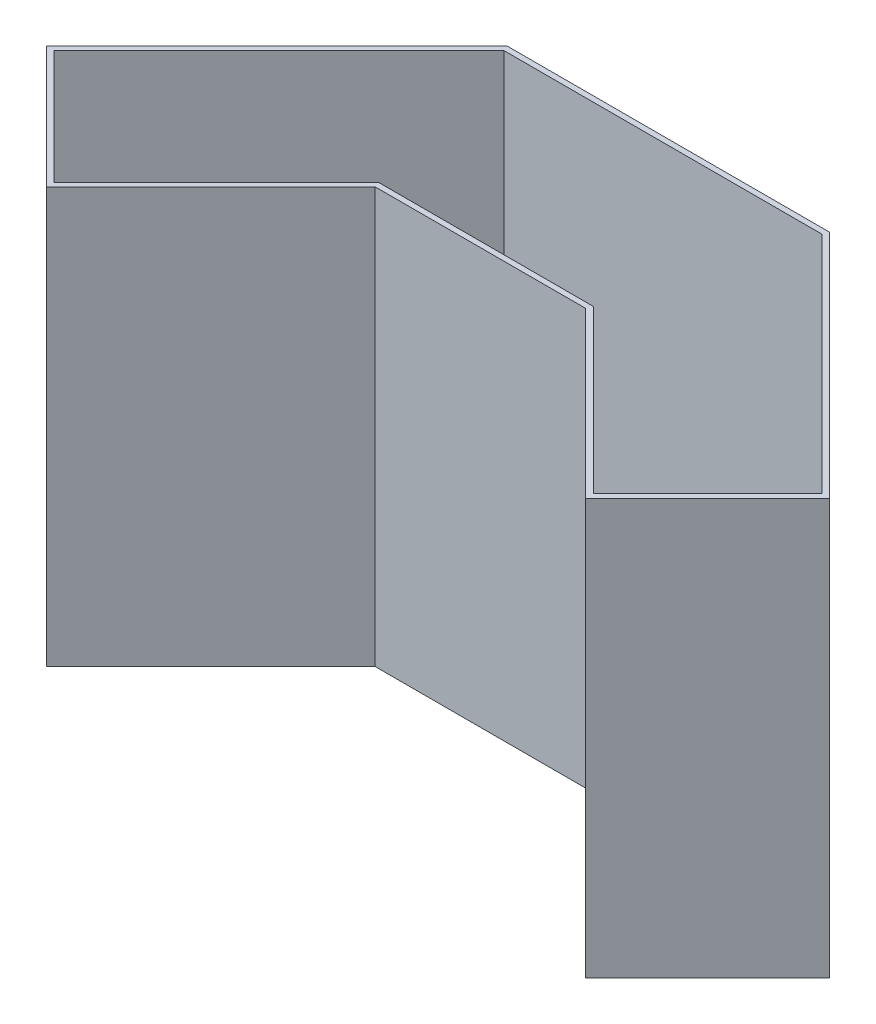
ISO-10303-21;
HEADER;
FILE_DESCRIPTION(('STEP AP214'),'2;1');
FILE_NAME('part.step','',(''),(''),'','','');
FILE_SCHEMA(('AUTOMOTIVE_DESIGN { 1 0 10303 214 1 1 1 1 }'));
ENDSEC;
DATA;
#1=APPLICATION_CONTEXT('core data for automotive mechanical design processes');
#2=APPLICATION_PROTOCOL_DEFINITION('international standard','automotive_design',2000,#1);
#3=PRODUCT_CONTEXT('',#1,'mechanical');
#4=PRODUCT('Part','Part','',(#3));
#5=PRODUCT_RELATED_PRODUCT_CATEGORY('part','',(#4));
#6=PRODUCT_DEFINITION_FORMATION('','',#4);
#7=PRODUCT_DEFINITION_CONTEXT('part definition',#1,'design');
#8=PRODUCT_DEFINITION('design','',#6,#7);
#9=PRODUCT_DEFINITION_SHAPE('','',#8);
#10=(LENGTH_UNIT() NAMED_UNIT(*) SI_UNIT(.MILLI.,.METRE.));
#11=(NAMED_UNIT(*) PLANE_ANGLE_UNIT() SI_UNIT($,.RADIAN.));
#12=(NAMED_UNIT(*) SI_UNIT($,.STERADIAN.) SOLID_ANGLE_UNIT());
#13=UNCERTAINTY_MEASURE_WITH_UNIT(LENGTH_MEASURE(1.E-05),#10,'distance_accuracy_value','');
#14=(GEOMETRIC_REPRESENTATION_CONTEXT(3) GLOBAL_UNCERTAINTY_ASSIGNED_CONTEXT((#13)) GLOBAL_UNIT_ASSIGNED_CONTEXT((#10,
#11,#12)) REPRESENTATION_CONTEXT('',''));
#15=CARTESIAN_POINT('',(0.,0.,0.));
#16=DIRECTION('',(0.,0.,1.));
#17=DIRECTION('',(1.,0.,0.));
#18=AXIS2_PLACEMENT_3D('',#15,#16,#17);
#19=CARTESIAN_POINT('',(0.,150.,0.));
#20=DIRECTION('',(0.,1.,0.));
#21=DIRECTION('',(0.,0.,1.));
#22=AXIS2_PLACEMENT_3D('',#19,#20,#21);
#23=PLANE('',#22);
#24=DIRECTION('',(-0.707106781186546,0.,0.707106781186549));
#25=VECTOR('',#24,1.);
#26=CARTESIAN_POINT('',(-58.2309419795097,150.,-2.));
#27=LINE('',#26,#25);
#28=CARTESIAN_POINT('',(-58.2309419795097,150.,-2.));
#29=VERTEX_POINT('',#28);
#30=CARTESIAN_POINT('',(-141.410357001439,150.,81.1794150219298));
#31=VERTEX_POINT('',#30);
#32=EDGE_CURVE('E218',#29,#31,#27,.T.);
#33=ORIENTED_EDGE('',*,*,#32,.T.);
#34=DIRECTION('',(0.707106781186549,0.,0.707106781186546));
#35=VECTOR('',#34,1.);
#36=CARTESIAN_POINT('',(-141.410357001439,150.,81.1794150219298));
#37=LINE('',#36,#35);
#38=CARTESIAN_POINT('',(-97.3702602736448,150.,125.219511749724));
#39=VERTEX_POINT('',#38);
#40=EDGE_CURVE('E225',#31,#39,#37,.T.);
#41=ORIENTED_EDGE('',*,*,#40,.T.);
#42=DIRECTION('',(0.707106781186546,0.,-0.707106781186549));
#43=VECTOR('',#42,1.);
#44=CARTESIAN_POINT('',(-38.0056469493385,150.,65.8548984254173));
#45=LINE('',#44,#43);
#46=CARTESIAN_POINT('',(-38.0056469493385,150.,65.8548984254173));
#47=VERTEX_POINT('',#46);
#48=EDGE_CURVE('E223',#39,#47,#45,.T.);
#49=ORIENTED_EDGE('',*,*,#48,.T.);
#50=DIRECTION('',(1.,0.,0.));
#51=VECTOR('',#50,1.);
#52=CARTESIAN_POINT('',(-38.0056469493385,150.,65.8548984254173));
#53=LINE('',#52,#51);
#54=CARTESIAN_POINT('',(38.0056469493385,150.,65.8548984254173));
#55=VERTEX_POINT('',#54);
#56=EDGE_CURVE('E227',#47,#55,#53,.T.);
#57=ORIENTED_EDGE('',*,*,#56,.T.);
#58=DIRECTION('',(0.707106781186546,0.,0.707106781186549));
#59=VECTOR('',#58,1.);
#60=CARTESIAN_POINT('',(38.0056469493385,150.,65.8548984254173));
#61=LINE('',#60,#59);
#62=CARTESIAN_POINT('',(97.3702602736448,150.,125.219511749724));
#63=VERTEX_POINT('',#62);
#64=EDGE_CURVE('E228',#55,#63,#61,.T.);
#65=ORIENTED_EDGE('',*,*,#64,.T.);
#66=DIRECTION('',(0.707106781186549,0.,-0.707106781186546));
#67=VECTOR('',#66,1.);
#68=CARTESIAN_POINT('',(141.410357001439,150.,81.1794150219297));
#69=LINE('',#68,#67);
#70=CARTESIAN_POINT('',(141.410357001439,150.,81.1794150219297));
#71=VERTEX_POINT('',#70);
#72=EDGE_CURVE('E231',#63,#71,#69,.T.);
#73=ORIENTED_EDGE('',*,*,#72,.T.);
#74=DIRECTION('',(-0.707106781186546,0.,-0.707106781186549));
#75=VECTOR('',#74,1.);
#76=CARTESIAN_POINT('',(58.2309419795097,150.,-2.));
#77=LINE('',#76,#75);
#78=CARTESIAN_POINT('',(58.2309419795097,150.,-2.));
#79=VERTEX_POINT('',#78);
#80=EDGE_CURVE('E233',#71,#79,#77,.T.);
#81=ORIENTED_EDGE('',*,*,#80,.T.);
#82=DIRECTION('',(-1.,0.,0.));
#83=VECTOR('',#82,1.);
#84=CARTESIAN_POINT('',(-58.2309419795097,150.,-2.));
#85=LINE('',#84,#83);
#86=EDGE_CURVE('E234',#79,#29,#85,.T.);
#87=ORIENTED_EDGE('',*,*,#86,.T.);
#88=EDGE_LOOP('',(#33,#41,#49,#57,#65,#73,#81,#87));
#89=FACE_BOUND('',#88,.T.);
#90=DIRECTION('',(0.707106781186549,0.,0.707106781186546));
#91=VECTOR('',#90,1.);
#92=CARTESIAN_POINT('',(-138.581929876693,150.,81.1794150219298));
#93=LINE('',#92,#91);
#94=CARTESIAN_POINT('',(-138.581929876693,150.,81.1794150219298));
#95=VERTEX_POINT('',#94);
#96=CARTESIAN_POINT('',(-97.3702602736448,150.,122.391084624978));
#97=VERTEX_POINT('',#96);
#98=EDGE_CURVE('E165',#95,#97,#93,.T.);
#99=ORIENTED_EDGE('',*,*,#98,.F.);
#100=DIRECTION('',(-0.707106781186546,0.,0.707106781186549));
#101=VECTOR('',#100,1.);
#102=CARTESIAN_POINT('',(-57.4025148547635,150.,0.));
#103=LINE('',#102,#101);
#104=CARTESIAN_POINT('',(-57.4025148547635,150.,0.));
#105=VERTEX_POINT('',#104);
#106=EDGE_CURVE('E152',#105,#95,#103,.T.);
#107=ORIENTED_EDGE('',*,*,#106,.F.);
#108=DIRECTION('',(-1.,0.,0.));
#109=VECTOR('',#108,1.);
#110=CARTESIAN_POINT('',(-57.4025148547635,150.,0.));
#111=LINE('',#110,#109);
#112=CARTESIAN_POINT('',(57.4025148547635,150.,0.));
#113=VERTEX_POINT('',#112);
#114=EDGE_CURVE('E187',#113,#105,#111,.T.);
#115=ORIENTED_EDGE('',*,*,#114,.F.);
#116=DIRECTION('',(-0.707106781186546,0.,-0.707106781186549));
#117=VECTOR('',#116,1.);
#118=CARTESIAN_POINT('',(57.4025148547635,150.,0.));
#119=LINE('',#118,#117);
#120=CARTESIAN_POINT('',(138.581929876693,150.,81.1794150219297));
#121=VERTEX_POINT('',#120);
#122=EDGE_CURVE('E183',#121,#113,#119,.T.);
#123=ORIENTED_EDGE('',*,*,#122,.F.);
#124=DIRECTION('',(0.707106781186549,0.,-0.707106781186546));
#125=VECTOR('',#124,1.);
#126=CARTESIAN_POINT('',(138.581929876693,150.,81.1794150219297));
#127=LINE('',#126,#125);
#128=CARTESIAN_POINT('',(97.3702602736448,150.,122.391084624978));
#129=VERTEX_POINT('',#128);
#130=EDGE_CURVE('E181',#129,#121,#127,.T.);
#131=ORIENTED_EDGE('',*,*,#130,.F.);
#132=DIRECTION('',(0.707106781186546,0.,0.707106781186549));
#133=VECTOR('',#132,1.);
#134=CARTESIAN_POINT('',(38.8340740740847,150.,63.8548984254173));
#135=LINE('',#134,#133);
#136=CARTESIAN_POINT('',(38.8340740740847,150.,63.8548984254173));
#137=VERTEX_POINT('',#136);
#138=EDGE_CURVE('E182',#137,#129,#135,.T.);
#139=ORIENTED_EDGE('',*,*,#138,.F.);
#140=DIRECTION('',(1.,0.,0.));
#141=VECTOR('',#140,1.);
#142=CARTESIAN_POINT('',(-38.8340740740847,150.,63.8548984254173));
#143=LINE('',#142,#141);
#144=CARTESIAN_POINT('',(-38.8340740740847,150.,63.8548984254173));
#145=VERTEX_POINT('',#144);
#146=EDGE_CURVE('E180',#145,#137,#143,.T.);
#147=ORIENTED_EDGE('',*,*,#146,.F.);
#148=DIRECTION('',(0.707106781186546,0.,-0.707106781186549));
#149=VECTOR('',#148,1.);
#150=CARTESIAN_POINT('',(-38.8340740740847,150.,63.8548984254173));
#151=LINE('',#150,#149);
#152=EDGE_CURVE('E175',#97,#145,#151,.T.);
#153=ORIENTED_EDGE('',*,*,#152,.F.);
#154=EDGE_LOOP('',(#99,#107,#115,#123,#131,#139,#147,#153));
#155=FACE_BOUND('',#154,.T.);
#156=ADVANCED_FACE('F41',(#89,#155),#23,.T.);
#157=CARTESIAN_POINT('',(0.,0.,0.));
#158=DIRECTION('',(0.,1.,0.));
#159=DIRECTION('',(0.,0.,1.));
#160=AXIS2_PLACEMENT_3D('',#157,#158,#159);
#161=PLANE('',#160);
#162=DIRECTION('',(-0.707106781186546,0.,0.707106781186549));
#163=VECTOR('',#162,1.);
#164=CARTESIAN_POINT('',(-58.2309419795097,0.,-2.));
#165=LINE('',#164,#163);
#166=CARTESIAN_POINT('',(-58.2309419795097,0.,-2.));
#167=VERTEX_POINT('',#166);
#168=CARTESIAN_POINT('',(-141.410357001439,0.,81.1794150219298));
#169=VERTEX_POINT('',#168);
#170=EDGE_CURVE('E168',#167,#169,#165,.T.);
#171=ORIENTED_EDGE('',*,*,#170,.F.);
#172=DIRECTION('',(-1.,0.,0.));
#173=VECTOR('',#172,1.);
#174=CARTESIAN_POINT('',(-58.2309419795097,0.,-2.));
#175=LINE('',#174,#173);
#176=CARTESIAN_POINT('',(58.2309419795097,0.,-2.));
#177=VERTEX_POINT('',#176);
#178=EDGE_CURVE('E224',#177,#167,#175,.T.);
#179=ORIENTED_EDGE('',*,*,#178,.F.);
#180=DIRECTION('',(-0.707106781186546,0.,-0.707106781186549));
#181=VECTOR('',#180,1.);
#182=CARTESIAN_POINT('',(58.2309419795097,0.,-2.));
#183=LINE('',#182,#181);
#184=CARTESIAN_POINT('',(141.410357001439,0.,81.1794150219297));
#185=VERTEX_POINT('',#184);
#186=EDGE_CURVE('E249',#185,#177,#183,.T.);
#187=ORIENTED_EDGE('',*,*,#186,.F.);
#188=DIRECTION('',(0.707106781186549,0.,-0.707106781186546));
#189=VECTOR('',#188,1.);
#190=CARTESIAN_POINT('',(141.410357001439,0.,81.1794150219297));
#191=LINE('',#190,#189);
#192=CARTESIAN_POINT('',(97.3702602736448,0.,125.219511749724));
#193=VERTEX_POINT('',#192);
#194=EDGE_CURVE('E248',#193,#185,#191,.T.);
#195=ORIENTED_EDGE('',*,*,#194,.F.);
#196=DIRECTION('',(0.707106781186546,0.,0.707106781186549));
#197=VECTOR('',#196,1.);
#198=CARTESIAN_POINT('',(38.0056469493385,0.,65.8548984254173));
#199=LINE('',#198,#197);
#200=CARTESIAN_POINT('',(38.0056469493385,0.,65.8548984254173));
#201=VERTEX_POINT('',#200);
#202=EDGE_CURVE('E246',#201,#193,#199,.T.);
#203=ORIENTED_EDGE('',*,*,#202,.F.);
#204=DIRECTION('',(1.,0.,0.));
#205=VECTOR('',#204,1.);
#206=CARTESIAN_POINT('',(-38.0056469493385,0.,65.8548984254173));
#207=LINE('',#206,#205);
#208=CARTESIAN_POINT('',(-38.0056469493385,0.,65.8548984254173));
#209=VERTEX_POINT('',#208);
#210=EDGE_CURVE('E243',#209,#201,#207,.T.);
#211=ORIENTED_EDGE('',*,*,#210,.F.);
#212=DIRECTION('',(0.707106781186546,0.,-0.707106781186549));
#213=VECTOR('',#212,1.);
#214=CARTESIAN_POINT('',(-38.0056469493385,0.,65.8548984254173));
#215=LINE('',#214,#213);
#216=CARTESIAN_POINT('',(-97.3702602736448,0.,125.219511749724));
#217=VERTEX_POINT('',#216);
#218=EDGE_CURVE('E242',#217,#209,#215,.T.);
#219=ORIENTED_EDGE('',*,*,#218,.F.);
#220=DIRECTION('',(0.707106781186549,0.,0.707106781186546));
#221=VECTOR('',#220,1.);
#222=CARTESIAN_POINT('',(-141.410357001439,0.,81.1794150219298));
#223=LINE('',#222,#221);
#224=EDGE_CURVE('E238',#169,#217,#223,.T.);
#225=ORIENTED_EDGE('',*,*,#224,.F.);
#226=EDGE_LOOP('',(#171,#179,#187,#195,#203,#211,#219,#225));
#227=FACE_BOUND('',#226,.T.);
#228=DIRECTION('',(-0.707106781186546,0.,0.707106781186549));
#229=VECTOR('',#228,1.);
#230=CARTESIAN_POINT('',(-57.4025148547635,0.,0.));
#231=LINE('',#230,#229);
#232=CARTESIAN_POINT('',(-57.4025148547635,0.,0.));
#233=VERTEX_POINT('',#232);
#234=CARTESIAN_POINT('',(-138.581929876693,0.,81.1794150219298));
#235=VERTEX_POINT('',#234);
#236=EDGE_CURVE('E63',#233,#235,#231,.T.);
#237=ORIENTED_EDGE('',*,*,#236,.T.);
#238=DIRECTION('',(0.707106781186549,0.,0.707106781186546));
#239=VECTOR('',#238,1.);
#240=CARTESIAN_POINT('',(-138.581929876693,0.,81.1794150219298));
#241=LINE('',#240,#239);
#242=CARTESIAN_POINT('',(-97.3702602736448,0.,122.391084624978));
#243=VERTEX_POINT('',#242);
#244=EDGE_CURVE('E166',#235,#243,#241,.T.);
#245=ORIENTED_EDGE('',*,*,#244,.T.);
#246=DIRECTION('',(0.707106781186546,0.,-0.707106781186549));
#247=VECTOR('',#246,1.);
#248=CARTESIAN_POINT('',(-38.8340740740847,0.,63.8548984254173));
#249=LINE('',#248,#247);
#250=CARTESIAN_POINT('',(-38.8340740740847,0.,63.8548984254173));
#251=VERTEX_POINT('',#250);
#252=EDGE_CURVE('E191',#243,#251,#249,.T.);
#253=ORIENTED_EDGE('',*,*,#252,.T.);
#254=DIRECTION('',(1.,0.,0.));
#255=VECTOR('',#254,1.);
#256=CARTESIAN_POINT('',(-38.8340740740847,0.,63.8548984254173));
#257=LINE('',#256,#255);
#258=CARTESIAN_POINT('',(38.8340740740847,0.,63.8548984254173));
#259=VERTEX_POINT('',#258);
#260=EDGE_CURVE('E192',#251,#259,#257,.T.);
#261=ORIENTED_EDGE('',*,*,#260,.T.);
#262=DIRECTION('',(0.707106781186546,0.,0.707106781186549));
#263=VECTOR('',#262,1.);
#264=CARTESIAN_POINT('',(38.8340740740847,0.,63.8548984254173));
#265=LINE('',#264,#263);
#266=CARTESIAN_POINT('',(97.3702602736448,0.,122.391084624978));
#267=VERTEX_POINT('',#266);
#268=EDGE_CURVE('E197',#259,#267,#265,.T.);
#269=ORIENTED_EDGE('',*,*,#268,.T.);
#270=DIRECTION('',(0.707106781186549,0.,-0.707106781186546));
#271=VECTOR('',#270,1.);
#272=CARTESIAN_POINT('',(138.581929876693,0.,81.1794150219297));
#273=LINE('',#272,#271);
#274=CARTESIAN_POINT('',(138.581929876693,0.,81.1794150219297));
#275=VERTEX_POINT('',#274);
#276=EDGE_CURVE('E199',#267,#275,#273,.T.);
#277=ORIENTED_EDGE('',*,*,#276,.T.);
#278=DIRECTION('',(-0.707106781186546,0.,-0.707106781186549));
#279=VECTOR('',#278,1.);
#280=CARTESIAN_POINT('',(57.4025148547635,0.,0.));
#281=LINE('',#280,#279);
#282=CARTESIAN_POINT('',(57.4025148547635,0.,0.));
#283=VERTEX_POINT('',#282);
#284=EDGE_CURVE('E201',#275,#283,#281,.T.);
#285=ORIENTED_EDGE('',*,*,#284,.T.);
#286=DIRECTION('',(-1.,0.,0.));
#287=VECTOR('',#286,1.);
#288=CARTESIAN_POINT('',(-57.4025148547635,0.,0.));
#289=LINE('',#288,#287);
#290=EDGE_CURVE('E162',#283,#233,#289,.T.);
#291=ORIENTED_EDGE('',*,*,#290,.T.);
#292=EDGE_LOOP('',(#237,#245,#253,#261,#269,#277,#285,#291));
#293=FACE_BOUND('',#292,.T.);
#294=ADVANCED_FACE('F278',(#227,#293),#161,.F.);
#295=CARTESIAN_POINT('',(-58.2309419795097,150.,-2.));
#296=DIRECTION('',(0.707106781186549,0.,0.707106781186546));
#297=DIRECTION('',(0.707106781186546,0.,-0.707106781186549));
#298=AXIS2_PLACEMENT_3D('',#295,#296,#297);
#299=PLANE('',#298);
#300=ORIENTED_EDGE('',*,*,#170,.T.);
#301=DIRECTION('',(0.,-1.,0.));
#302=VECTOR('',#301,1.);
#303=CARTESIAN_POINT('',(-141.410357001439,150.,81.1794150219298));
#304=LINE('',#303,#302);
#305=EDGE_CURVE('E11',#31,#169,#304,.T.);
#306=ORIENTED_EDGE('',*,*,#305,.F.);
#307=ORIENTED_EDGE('',*,*,#32,.F.);
#308=DIRECTION('',(0.,-1.,0.));
#309=VECTOR('',#308,1.);
#310=CARTESIAN_POINT('',(-58.2309419795097,150.,-2.));
#311=LINE('',#310,#309);
#312=EDGE_CURVE('E240',#29,#167,#311,.T.);
#313=ORIENTED_EDGE('',*,*,#312,.T.);
#314=EDGE_LOOP('',(#300,#306,#307,#313));
#315=FACE_BOUND('',#314,.T.);
#316=ADVANCED_FACE('F43',(#315),#299,.F.);
#317=CARTESIAN_POINT('',(-141.410357001439,150.,81.1794150219298));
#318=DIRECTION('',(0.707106781186546,0.,-0.707106781186549));
#319=DIRECTION('',(-0.707106781186549,0.,-0.707106781186546));
#320=AXIS2_PLACEMENT_3D('',#317,#318,#319);
#321=PLANE('',#320);
#322=ORIENTED_EDGE('',*,*,#224,.T.);
#323=DIRECTION('',(0.,-1.,0.));
#324=VECTOR('',#323,1.);
#325=CARTESIAN_POINT('',(-97.3702602736448,150.,125.219511749724));
#326=LINE('',#325,#324);
#327=EDGE_CURVE('E47',#39,#217,#326,.T.);
#328=ORIENTED_EDGE('',*,*,#327,.F.);
#329=ORIENTED_EDGE('',*,*,#40,.F.);
#330=ORIENTED_EDGE('',*,*,#305,.T.);
#331=EDGE_LOOP('',(#322,#328,#329,#330));
#332=FACE_BOUND('',#331,.T.);
#333=ADVANCED_FACE('F297',(#332),#321,.F.);
#334=CARTESIAN_POINT('',(-38.0056469493385,150.,65.8548984254173));
#335=DIRECTION('',(-0.707106781186549,0.,-0.707106781186546));
#336=DIRECTION('',(-0.707106781186546,0.,0.707106781186549));
#337=AXIS2_PLACEMENT_3D('',#334,#335,#336);
#338=PLANE('',#337);
#339=ORIENTED_EDGE('',*,*,#218,.T.);
#340=DIRECTION('',(0.,-1.,0.));
#341=VECTOR('',#340,1.);
#342=CARTESIAN_POINT('',(-38.0056469493385,150.,65.8548984254173));
#343=LINE('',#342,#341);
#344=EDGE_CURVE('E270',#47,#209,#343,.T.);
#345=ORIENTED_EDGE('',*,*,#344,.F.);
#346=ORIENTED_EDGE('',*,*,#48,.F.);
#347=ORIENTED_EDGE('',*,*,#327,.T.);
#348=EDGE_LOOP('',(#339,#345,#346,#347));
#349=FACE_BOUND('',#348,.T.);
#350=ADVANCED_FACE('F273',(#349),#338,.F.);
#351=CARTESIAN_POINT('',(-38.0056469493385,150.,65.8548984254173));
#352=DIRECTION('',(0.,0.,-1.));
#353=DIRECTION('',(-1.,0.,0.));
#354=AXIS2_PLACEMENT_3D('',#351,#352,#353);
#355=PLANE('',#354);
#356=ORIENTED_EDGE('',*,*,#210,.T.);
#357=DIRECTION('',(0.,-1.,0.));
#358=VECTOR('',#357,1.);
#359=CARTESIAN_POINT('',(38.0056469493385,150.,65.8548984254173));
#360=LINE('',#359,#358);
#361=EDGE_CURVE('E262',#55,#201,#360,.T.);
#362=ORIENTED_EDGE('',*,*,#361,.F.);
#363=ORIENTED_EDGE('',*,*,#56,.F.);
#364=ORIENTED_EDGE('',*,*,#344,.T.);
#365=EDGE_LOOP('',(#356,#362,#363,#364));
#366=FACE_BOUND('',#365,.T.);
#367=ADVANCED_FACE('F286',(#366),#355,.F.);
#368=CARTESIAN_POINT('',(38.0056469493385,150.,65.8548984254173));
#369=DIRECTION('',(0.707106781186549,0.,-0.707106781186546));
#370=DIRECTION('',(-0.707106781186546,0.,-0.707106781186549));
#371=AXIS2_PLACEMENT_3D('',#368,#369,#370);
#372=PLANE('',#371);
#373=ORIENTED_EDGE('',*,*,#202,.T.);
#374=DIRECTION('',(0.,-1.,0.));
#375=VECTOR('',#374,1.);
#376=CARTESIAN_POINT('',(97.3702602736448,150.,125.219511749724));
#377=LINE('',#376,#375);
#378=EDGE_CURVE('E261',#63,#193,#377,.T.);
#379=ORIENTED_EDGE('',*,*,#378,.F.);
#380=ORIENTED_EDGE('',*,*,#64,.F.);
#381=ORIENTED_EDGE('',*,*,#361,.T.);
#382=EDGE_LOOP('',(#373,#379,#380,#381));
#383=FACE_BOUND('',#382,.T.);
#384=ADVANCED_FACE('F289',(#383),#372,.F.);
#385=CARTESIAN_POINT('',(141.410357001439,150.,81.1794150219297));
#386=DIRECTION('',(-0.707106781186546,0.,-0.707106781186549));
#387=DIRECTION('',(-0.707106781186549,0.,0.707106781186546));
#388=AXIS2_PLACEMENT_3D('',#385,#386,#387);
#389=PLANE('',#388);
#390=ORIENTED_EDGE('',*,*,#194,.T.);
#391=DIRECTION('',(0.,-1.,0.));
#392=VECTOR('',#391,1.);
#393=CARTESIAN_POINT('',(141.410357001439,150.,81.1794150219297));
#394=LINE('',#393,#392);
#395=EDGE_CURVE('E256',#71,#185,#394,.T.);
#396=ORIENTED_EDGE('',*,*,#395,.F.);
#397=ORIENTED_EDGE('',*,*,#72,.F.);
#398=ORIENTED_EDGE('',*,*,#378,.T.);
#399=EDGE_LOOP('',(#390,#396,#397,#398));
#400=FACE_BOUND('',#399,.T.);
#401=ADVANCED_FACE('F309',(#400),#389,.F.);
#402=CARTESIAN_POINT('',(58.2309419795097,150.,-2.));
#403=DIRECTION('',(-0.707106781186549,0.,0.707106781186546));
#404=DIRECTION('',(0.707106781186546,0.,0.707106781186549));
#405=AXIS2_PLACEMENT_3D('',#402,#403,#404);
#406=PLANE('',#405);
#407=ORIENTED_EDGE('',*,*,#186,.T.);
#408=DIRECTION('',(0.,-1.,0.));
#409=VECTOR('',#408,1.);
#410=CARTESIAN_POINT('',(58.2309419795097,150.,-2.));
#411=LINE('',#410,#409);
#412=EDGE_CURVE('E254',#79,#177,#411,.T.);
#413=ORIENTED_EDGE('',*,*,#412,.F.);
#414=ORIENTED_EDGE('',*,*,#80,.F.);
#415=ORIENTED_EDGE('',*,*,#395,.T.);
#416=EDGE_LOOP('',(#407,#413,#414,#415));
#417=FACE_BOUND('',#416,.T.);
#418=ADVANCED_FACE('F306',(#417),#406,.F.);
#419=CARTESIAN_POINT('',(-58.2309419795097,150.,-2.));
#420=DIRECTION('',(0.,0.,1.));
#421=DIRECTION('',(1.,0.,0.));
#422=AXIS2_PLACEMENT_3D('',#419,#420,#421);
#423=PLANE('',#422);
#424=ORIENTED_EDGE('',*,*,#178,.T.);
#425=ORIENTED_EDGE('',*,*,#312,.F.);
#426=ORIENTED_EDGE('',*,*,#86,.F.);
#427=ORIENTED_EDGE('',*,*,#412,.T.);
#428=EDGE_LOOP('',(#424,#425,#426,#427));
#429=FACE_BOUND('',#428,.T.);
#430=ADVANCED_FACE('F303',(#429),#423,.F.);
#431=CARTESIAN_POINT('',(-57.4025148547635,150.,0.));
#432=DIRECTION('',(0.707106781186549,0.,0.707106781186546));
#433=DIRECTION('',(0.707106781186546,0.,-0.707106781186549));
#434=AXIS2_PLACEMENT_3D('',#431,#432,#433);
#435=PLANE('',#434);
#436=ORIENTED_EDGE('',*,*,#236,.F.);
#437=DIRECTION('',(0.,-1.,0.));
#438=VECTOR('',#437,1.);
#439=CARTESIAN_POINT('',(-57.4025148547635,150.,0.));
#440=LINE('',#439,#438);
#441=EDGE_CURVE('E158',#105,#233,#440,.T.);
#442=ORIENTED_EDGE('',*,*,#441,.F.);
#443=ORIENTED_EDGE('',*,*,#106,.T.);
#444=DIRECTION('',(0.,-1.,0.));
#445=VECTOR('',#444,1.);
#446=CARTESIAN_POINT('',(-138.581929876693,150.,81.1794150219298));
#447=LINE('',#446,#445);
#448=EDGE_CURVE('E160',#95,#235,#447,.T.);
#449=ORIENTED_EDGE('',*,*,#448,.T.);
#450=EDGE_LOOP('',(#436,#442,#443,#449));
#451=FACE_BOUND('',#450,.T.);
#452=ADVANCED_FACE('F156',(#451),#435,.T.);
#453=CARTESIAN_POINT('',(-138.581929876693,150.,81.1794150219298));
#454=DIRECTION('',(0.707106781186546,0.,-0.707106781186549));
#455=DIRECTION('',(-0.707106781186549,0.,-0.707106781186546));
#456=AXIS2_PLACEMENT_3D('',#453,#454,#455);
#457=PLANE('',#456);
#458=ORIENTED_EDGE('',*,*,#244,.F.);
#459=ORIENTED_EDGE('',*,*,#448,.F.);
#460=ORIENTED_EDGE('',*,*,#98,.T.);
#461=DIRECTION('',(0.,-1.,0.));
#462=VECTOR('',#461,1.);
#463=CARTESIAN_POINT('',(-97.3702602736448,150.,122.391084624978));
#464=LINE('',#463,#462);
#465=EDGE_CURVE('E171',#97,#243,#464,.T.);
#466=ORIENTED_EDGE('',*,*,#465,.T.);
#467=EDGE_LOOP('',(#458,#459,#460,#466));
#468=FACE_BOUND('',#467,.T.);
#469=ADVANCED_FACE('F167',(#468),#457,.T.);
#470=CARTESIAN_POINT('',(-38.8340740740847,150.,63.8548984254173));
#471=DIRECTION('',(-0.707106781186549,0.,-0.707106781186546));
#472=DIRECTION('',(-0.707106781186546,0.,0.707106781186549));
#473=AXIS2_PLACEMENT_3D('',#470,#471,#472);
#474=PLANE('',#473);
#475=ORIENTED_EDGE('',*,*,#252,.F.);
#476=ORIENTED_EDGE('',*,*,#465,.F.);
#477=ORIENTED_EDGE('',*,*,#152,.T.);
#478=DIRECTION('',(0.,-1.,0.));
#479=VECTOR('',#478,1.);
#480=CARTESIAN_POINT('',(-38.8340740740847,150.,63.8548984254173));
#481=LINE('',#480,#479);
#482=EDGE_CURVE('E216',#145,#251,#481,.T.);
#483=ORIENTED_EDGE('',*,*,#482,.T.);
#484=EDGE_LOOP('',(#475,#476,#477,#483));
#485=FACE_BOUND('',#484,.T.);
#486=ADVANCED_FACE('F333',(#485),#474,.T.);
#487=CARTESIAN_POINT('',(-38.8340740740847,150.,63.8548984254173));
#488=DIRECTION('',(0.,0.,-1.));
#489=DIRECTION('',(-1.,0.,0.));
#490=AXIS2_PLACEMENT_3D('',#487,#488,#489);
#491=PLANE('',#490);
#492=ORIENTED_EDGE('',*,*,#260,.F.);
#493=ORIENTED_EDGE('',*,*,#482,.F.);
#494=ORIENTED_EDGE('',*,*,#146,.T.);
#495=DIRECTION('',(0.,-1.,0.));
#496=VECTOR('',#495,1.);
#497=CARTESIAN_POINT('',(38.8340740740847,150.,63.8548984254173));
#498=LINE('',#497,#496);
#499=EDGE_CURVE('E212',#137,#259,#498,.T.);
#500=ORIENTED_EDGE('',*,*,#499,.T.);
#501=EDGE_LOOP('',(#492,#493,#494,#500));
#502=FACE_BOUND('',#501,.T.);
#503=ADVANCED_FACE('F338',(#502),#491,.T.);
#504=CARTESIAN_POINT('',(38.8340740740847,150.,63.8548984254173));
#505=DIRECTION('',(0.707106781186549,0.,-0.707106781186546));
#506=DIRECTION('',(-0.707106781186546,0.,-0.707106781186549));
#507=AXIS2_PLACEMENT_3D('',#504,#505,#506);
#508=PLANE('',#507);
#509=ORIENTED_EDGE('',*,*,#268,.F.);
#510=ORIENTED_EDGE('',*,*,#499,.F.);
#511=ORIENTED_EDGE('',*,*,#138,.T.);
#512=DIRECTION('',(0.,-1.,0.));
#513=VECTOR('',#512,1.);
#514=CARTESIAN_POINT('',(97.3702602736448,150.,122.391084624978));
#515=LINE('',#514,#513);
#516=EDGE_CURVE('E215',#129,#267,#515,.T.);
#517=ORIENTED_EDGE('',*,*,#516,.T.);
#518=EDGE_LOOP('',(#509,#510,#511,#517));
#519=FACE_BOUND('',#518,.T.);
#520=ADVANCED_FACE('F344',(#519),#508,.T.);
#521=CARTESIAN_POINT('',(138.581929876693,150.,81.1794150219297));
#522=DIRECTION('',(-0.707106781186546,0.,-0.707106781186549));
#523=DIRECTION('',(-0.707106781186549,0.,0.707106781186546));
#524=AXIS2_PLACEMENT_3D('',#521,#522,#523);
#525=PLANE('',#524);
#526=ORIENTED_EDGE('',*,*,#276,.F.);
#527=ORIENTED_EDGE('',*,*,#516,.F.);
#528=ORIENTED_EDGE('',*,*,#130,.T.);
#529=DIRECTION('',(0.,-1.,0.));
#530=VECTOR('',#529,1.);
#531=CARTESIAN_POINT('',(138.581929876693,150.,81.1794150219297));
#532=LINE('',#531,#530);
#533=EDGE_CURVE('E209',#121,#275,#532,.T.);
#534=ORIENTED_EDGE('',*,*,#533,.T.);
#535=EDGE_LOOP('',(#526,#527,#528,#534));
#536=FACE_BOUND('',#535,.T.);
#537=ADVANCED_FACE('F349',(#536),#525,.T.);
#538=CARTESIAN_POINT('',(57.4025148547635,150.,0.));
#539=DIRECTION('',(-0.707106781186549,0.,0.707106781186546));
#540=DIRECTION('',(0.707106781186546,0.,0.707106781186549));
#541=AXIS2_PLACEMENT_3D('',#538,#539,#540);
#542=PLANE('',#541);
#543=ORIENTED_EDGE('',*,*,#284,.F.);
#544=ORIENTED_EDGE('',*,*,#533,.F.);
#545=ORIENTED_EDGE('',*,*,#122,.T.);
#546=DIRECTION('',(0.,-1.,0.));
#547=VECTOR('',#546,1.);
#548=CARTESIAN_POINT('',(57.4025148547635,150.,0.));
#549=LINE('',#548,#547);
#550=EDGE_CURVE('E57',#113,#283,#549,.T.);
#551=ORIENTED_EDGE('',*,*,#550,.T.);
#552=EDGE_LOOP('',(#543,#544,#545,#551));
#553=FACE_BOUND('',#552,.T.);
#554=ADVANCED_FACE('F354',(#553),#542,.T.);
#555=CARTESIAN_POINT('',(-57.4025148547635,150.,0.));
#556=DIRECTION('',(0.,0.,1.));
#557=DIRECTION('',(1.,0.,0.));
#558=AXIS2_PLACEMENT_3D('',#555,#556,#557);
#559=PLANE('',#558);
#560=ORIENTED_EDGE('',*,*,#290,.F.);
#561=ORIENTED_EDGE('',*,*,#550,.F.);
#562=ORIENTED_EDGE('',*,*,#114,.T.);
#563=ORIENTED_EDGE('',*,*,#441,.T.);
#564=EDGE_LOOP('',(#560,#561,#562,#563));
#565=FACE_BOUND('',#564,.T.);
#566=ADVANCED_FACE('F360',(#565),#559,.T.);
#567=CLOSED_SHELL('',(#156,#294,#316,#333,#350,#367,#384,#401,#418,#430,#452,#469,#486,#503,
#520,#537,#554,#566));
#568=MANIFOLD_SOLID_BREP('B2',#567);
#569=ADVANCED_BREP_SHAPE_REPRESENTATION('',(#18,#568),#14);
#570=SHAPE_DEFINITION_REPRESENTATION(#9,#569);
ENDSEC;
END-ISO-10303-21;
